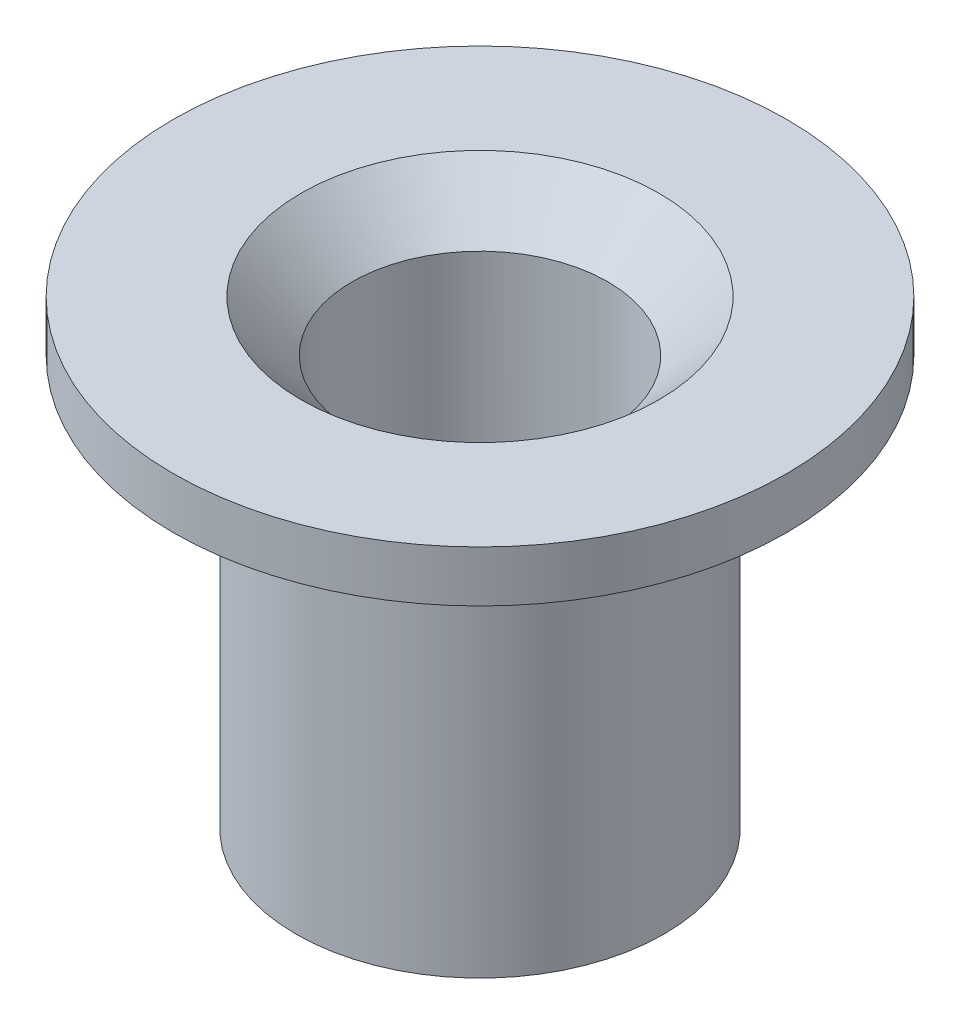
ISO-10303-21;
HEADER;
FILE_DESCRIPTION(('STEP AP214'),'2;1');
FILE_NAME('part.step','',(''),(''),'','','');
FILE_SCHEMA(('AUTOMOTIVE_DESIGN { 1 0 10303 214 1 1 1 1 }'));
ENDSEC;
DATA;
#1=APPLICATION_CONTEXT('core data for automotive mechanical design processes');
#2=APPLICATION_PROTOCOL_DEFINITION('international standard','automotive_design',2000,#1);
#3=PRODUCT_CONTEXT('',#1,'mechanical');
#4=PRODUCT('Part','Part','',(#3));
#5=PRODUCT_RELATED_PRODUCT_CATEGORY('part','',(#4));
#6=PRODUCT_DEFINITION_FORMATION('','',#4);
#7=PRODUCT_DEFINITION_CONTEXT('part definition',#1,'design');
#8=PRODUCT_DEFINITION('design','',#6,#7);
#9=PRODUCT_DEFINITION_SHAPE('','',#8);
#10=(LENGTH_UNIT() NAMED_UNIT(*) SI_UNIT(.MILLI.,.METRE.));
#11=(NAMED_UNIT(*) PLANE_ANGLE_UNIT() SI_UNIT($,.RADIAN.));
#12=(NAMED_UNIT(*) SI_UNIT($,.STERADIAN.) SOLID_ANGLE_UNIT());
#13=UNCERTAINTY_MEASURE_WITH_UNIT(LENGTH_MEASURE(1.E-05),#10,'distance_accuracy_value','');
#14=(GEOMETRIC_REPRESENTATION_CONTEXT(3) GLOBAL_UNCERTAINTY_ASSIGNED_CONTEXT((#13)) GLOBAL_UNIT_ASSIGNED_CONTEXT((#10,
#11,#12)) REPRESENTATION_CONTEXT('',''));
#15=CARTESIAN_POINT('',(0.,0.,0.));
#16=DIRECTION('',(0.,0.,1.));
#17=DIRECTION('',(1.,0.,0.));
#18=AXIS2_PLACEMENT_3D('',#15,#16,#17);
#19=CARTESIAN_POINT('',(0.,9.,-6.));
#20=DIRECTION('',(0.,1.,0.));
#21=DIRECTION('',(0.,0.,1.));
#22=AXIS2_PLACEMENT_3D('',#19,#20,#21);
#23=PLANE('',#22);
#24=CARTESIAN_POINT('',(0.,9.,0.));
#25=DIRECTION('',(0.,1.,0.));
#26=DIRECTION('',(0.,0.,1.));
#27=AXIS2_PLACEMENT_3D('',#24,#25,#26);
#28=CIRCLE('',#27,3.5);
#29=CARTESIAN_POINT('',(0.,9.,3.5));
#30=VERTEX_POINT('',#29);
#31=EDGE_CURVE('E48',#30,#30,#28,.F.);
#32=ORIENTED_EDGE('',*,*,#31,.T.);
#33=EDGE_LOOP('',(#32));
#34=FACE_BOUND('',#33,.T.);
#35=CARTESIAN_POINT('',(0.,9.,0.));
#36=DIRECTION('',(0.,-1.,0.));
#37=DIRECTION('',(0.,0.,-1.));
#38=AXIS2_PLACEMENT_3D('',#35,#36,#37);
#39=CIRCLE('',#38,6.);
#40=CARTESIAN_POINT('',(0.,9.,-6.));
#41=VERTEX_POINT('',#40);
#42=EDGE_CURVE('E76',#41,#41,#39,.T.);
#43=ORIENTED_EDGE('',*,*,#42,.F.);
#44=EDGE_LOOP('',(#43));
#45=FACE_BOUND('',#44,.T.);
#46=ADVANCED_FACE('F39',(#34,#45),#23,.T.);
#47=CARTESIAN_POINT('',(0.,0.,0.));
#48=DIRECTION('',(0.,-1.,0.));
#49=DIRECTION('',(0.,0.,-1.));
#50=AXIS2_PLACEMENT_3D('',#47,#48,#49);
#51=CYLINDRICAL_SURFACE('',#50,2.5);
#52=CARTESIAN_POINT('',(0.,8.,0.));
#53=DIRECTION('',(0.,1.,0.));
#54=DIRECTION('',(0.,0.,1.));
#55=AXIS2_PLACEMENT_3D('',#52,#53,#54);
#56=CIRCLE('',#55,2.5);
#57=CARTESIAN_POINT('',(0.,8.,2.5));
#58=VERTEX_POINT('',#57);
#59=EDGE_CURVE('E10',#58,#58,#56,.T.);
#60=ORIENTED_EDGE('',*,*,#59,.T.);
#61=EDGE_LOOP('',(#60));
#62=FACE_BOUND('',#61,.T.);
#63=CARTESIAN_POINT('',(0.,0.,0.));
#64=DIRECTION('',(0.,-1.,0.));
#65=DIRECTION('',(0.,0.,-1.));
#66=AXIS2_PLACEMENT_3D('',#63,#64,#65);
#67=CIRCLE('',#66,2.5);
#68=CARTESIAN_POINT('',(0.,0.,-2.5));
#69=VERTEX_POINT('',#68);
#70=EDGE_CURVE('E64',#69,#69,#67,.T.);
#71=ORIENTED_EDGE('',*,*,#70,.T.);
#72=EDGE_LOOP('',(#71));
#73=FACE_BOUND('',#72,.T.);
#74=ADVANCED_FACE('F85',(#62,#73),#51,.F.);
#75=CARTESIAN_POINT('',(0.,0.,-2.5));
#76=DIRECTION('',(0.,-1.,0.));
#77=DIRECTION('',(0.,0.,-1.));
#78=AXIS2_PLACEMENT_3D('',#75,#76,#77);
#79=PLANE('',#78);
#80=CARTESIAN_POINT('',(0.,0.,0.));
#81=DIRECTION('',(0.,-1.,0.));
#82=DIRECTION('',(0.,0.,-1.));
#83=AXIS2_PLACEMENT_3D('',#80,#81,#82);
#84=CIRCLE('',#83,3.6);
#85=CARTESIAN_POINT('',(0.,0.,-3.6));
#86=VERTEX_POINT('',#85);
#87=EDGE_CURVE('E68',#86,#86,#84,.T.);
#88=ORIENTED_EDGE('',*,*,#87,.T.);
#89=EDGE_LOOP('',(#88));
#90=FACE_BOUND('',#89,.T.);
#91=ORIENTED_EDGE('',*,*,#70,.F.);
#92=EDGE_LOOP('',(#91));
#93=FACE_BOUND('',#92,.T.);
#94=ADVANCED_FACE('F90',(#90,#93),#79,.T.);
#95=CARTESIAN_POINT('',(0.,0.,0.));
#96=DIRECTION('',(0.,-1.,0.));
#97=DIRECTION('',(0.,0.,-1.));
#98=AXIS2_PLACEMENT_3D('',#95,#96,#97);
#99=CYLINDRICAL_SURFACE('',#98,3.6);
#100=CARTESIAN_POINT('',(0.,6.99999999999999,0.));
#101=DIRECTION('',(0.,-1.,0.));
#102=DIRECTION('',(0.,0.,-1.));
#103=AXIS2_PLACEMENT_3D('',#100,#101,#102);
#104=CIRCLE('',#103,3.6);
#105=CARTESIAN_POINT('',(0.,7.,-3.6));
#106=VERTEX_POINT('',#105);
#107=EDGE_CURVE('E58',#106,#106,#104,.T.);
#108=ORIENTED_EDGE('',*,*,#107,.T.);
#109=EDGE_LOOP('',(#108));
#110=FACE_BOUND('',#109,.T.);
#111=ORIENTED_EDGE('',*,*,#87,.F.);
#112=EDGE_LOOP('',(#111));
#113=FACE_BOUND('',#112,.T.);
#114=ADVANCED_FACE('F110',(#110,#113),#99,.T.);
#115=CARTESIAN_POINT('',(0.,8.,-3.6));
#116=DIRECTION('',(0.,-1.,0.));
#117=DIRECTION('',(0.,0.,-1.));
#118=AXIS2_PLACEMENT_3D('',#115,#116,#117);
#119=PLANE('',#118);
#120=CARTESIAN_POINT('',(0.,8.,0.));
#121=DIRECTION('',(0.,-1.,0.));
#122=DIRECTION('',(0.,0.,-1.));
#123=AXIS2_PLACEMENT_3D('',#120,#121,#122);
#124=CIRCLE('',#123,4.6);
#125=CARTESIAN_POINT('',(0.,8.,-4.59999999999999));
#126=VERTEX_POINT('',#125);
#127=EDGE_CURVE('E53',#126,#126,#124,.F.);
#128=ORIENTED_EDGE('',*,*,#127,.T.);
#129=EDGE_LOOP('',(#128));
#130=FACE_BOUND('',#129,.T.);
#131=CARTESIAN_POINT('',(0.,8.,0.));
#132=DIRECTION('',(0.,-1.,0.));
#133=DIRECTION('',(0.,0.,-1.));
#134=AXIS2_PLACEMENT_3D('',#131,#132,#133);
#135=CIRCLE('',#134,6.);
#136=CARTESIAN_POINT('',(0.,8.,-6.));
#137=VERTEX_POINT('',#136);
#138=EDGE_CURVE('E72',#137,#137,#135,.T.);
#139=ORIENTED_EDGE('',*,*,#138,.T.);
#140=EDGE_LOOP('',(#139));
#141=FACE_BOUND('',#140,.T.);
#142=ADVANCED_FACE('F104',(#130,#141),#119,.T.);
#143=CARTESIAN_POINT('',(0.,0.,0.));
#144=DIRECTION('',(0.,-1.,0.));
#145=DIRECTION('',(0.,0.,-1.));
#146=AXIS2_PLACEMENT_3D('',#143,#144,#145);
#147=CYLINDRICAL_SURFACE('',#146,6.);
#148=ORIENTED_EDGE('',*,*,#42,.T.);
#149=EDGE_LOOP('',(#148));
#150=FACE_BOUND('',#149,.T.);
#151=ORIENTED_EDGE('',*,*,#138,.F.);
#152=EDGE_LOOP('',(#151));
#153=FACE_BOUND('',#152,.T.);
#154=ADVANCED_FACE('F81',(#150,#153),#147,.T.);
#155=CARTESIAN_POINT('',(0.,6.99999999999999,0.));
#156=DIRECTION('',(0.,1.,0.));
#157=DIRECTION('',(0.,0.,1.));
#158=AXIS2_PLACEMENT_3D('',#155,#156,#157);
#159=CONICAL_SURFACE('',#158,3.6,0.785398163397444);
#160=ORIENTED_EDGE('',*,*,#127,.F.);
#161=EDGE_LOOP('',(#160));
#162=FACE_BOUND('',#161,.T.);
#163=ORIENTED_EDGE('',*,*,#107,.F.);
#164=EDGE_LOOP('',(#163));
#165=FACE_BOUND('',#164,.T.);
#166=ADVANCED_FACE('F94',(#162,#165),#159,.T.);
#167=CARTESIAN_POINT('',(0.,9.,0.));
#168=DIRECTION('',(0.,1.,0.));
#169=DIRECTION('',(0.,0.,1.));
#170=AXIS2_PLACEMENT_3D('',#167,#168,#169);
#171=CONICAL_SURFACE('',#170,3.5,0.785398163397447);
#172=ORIENTED_EDGE('',*,*,#59,.F.);
#173=EDGE_LOOP('',(#172));
#174=FACE_BOUND('',#173,.T.);
#175=ORIENTED_EDGE('',*,*,#31,.F.);
#176=EDGE_LOOP('',(#175));
#177=FACE_BOUND('',#176,.T.);
#178=ADVANCED_FACE('F42',(#174,#177),#171,.F.);
#179=CLOSED_SHELL('',(#46,#74,#94,#114,#142,#154,#166,#178));
#180=MANIFOLD_SOLID_BREP('B2',#179);
#181=ADVANCED_BREP_SHAPE_REPRESENTATION('',(#18,#180),#14);
#182=SHAPE_DEFINITION_REPRESENTATION(#9,#181);
ENDSEC;
END-ISO-10303-21;
